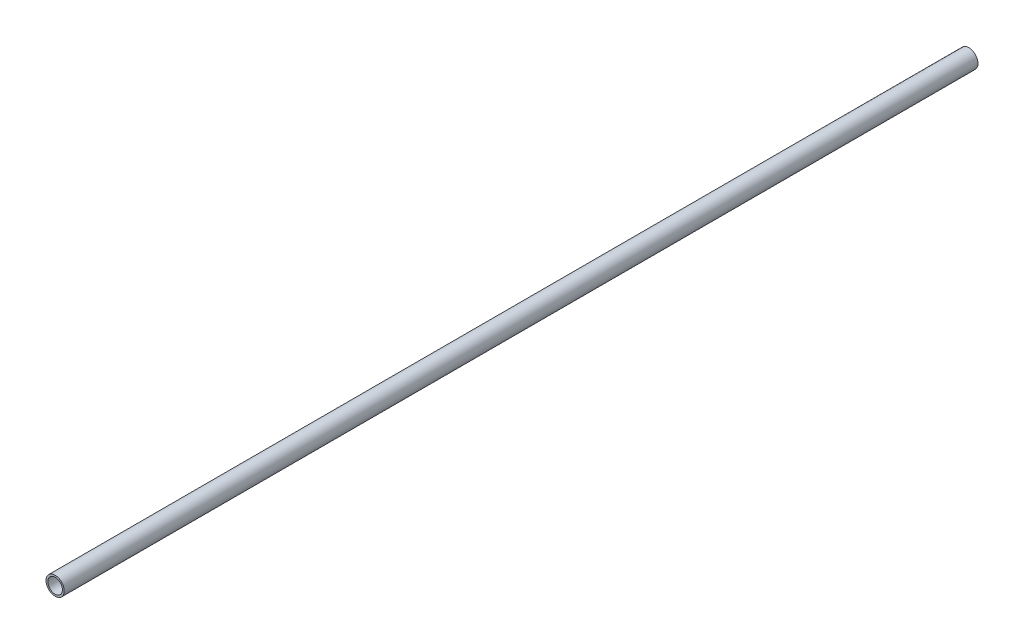
ISO-10303-21;
HEADER;
FILE_DESCRIPTION(('STEP AP214'),'2;1');
FILE_NAME('part.step','',(''),(''),'','','');
FILE_SCHEMA(('AUTOMOTIVE_DESIGN { 1 0 10303 214 1 1 1 1 }'));
ENDSEC;
DATA;
#1=APPLICATION_CONTEXT('core data for automotive mechanical design processes');
#2=APPLICATION_PROTOCOL_DEFINITION('international standard','automotive_design',2000,#1);
#3=PRODUCT_CONTEXT('',#1,'mechanical');
#4=PRODUCT('Part','Part','',(#3));
#5=PRODUCT_RELATED_PRODUCT_CATEGORY('part','',(#4));
#6=PRODUCT_DEFINITION_FORMATION('','',#4);
#7=PRODUCT_DEFINITION_CONTEXT('part definition',#1,'design');
#8=PRODUCT_DEFINITION('design','',#6,#7);
#9=PRODUCT_DEFINITION_SHAPE('','',#8);
#10=(LENGTH_UNIT() NAMED_UNIT(*) SI_UNIT(.MILLI.,.METRE.));
#11=(NAMED_UNIT(*) PLANE_ANGLE_UNIT() SI_UNIT($,.RADIAN.));
#12=(NAMED_UNIT(*) SI_UNIT($,.STERADIAN.) SOLID_ANGLE_UNIT());
#13=UNCERTAINTY_MEASURE_WITH_UNIT(LENGTH_MEASURE(1.E-05),#10,'distance_accuracy_value','');
#14=(GEOMETRIC_REPRESENTATION_CONTEXT(3) GLOBAL_UNCERTAINTY_ASSIGNED_CONTEXT((#13)) GLOBAL_UNIT_ASSIGNED_CONTEXT((#10,
#11,#12)) REPRESENTATION_CONTEXT('',''));
#15=CARTESIAN_POINT('',(0.,0.,0.));
#16=DIRECTION('',(0.,0.,1.));
#17=DIRECTION('',(1.,0.,0.));
#18=AXIS2_PLACEMENT_3D('',#15,#16,#17);
#19=CARTESIAN_POINT('',(0.,0.,500.));
#20=DIRECTION('',(0.,0.,-1.));
#21=DIRECTION('',(-1.,0.,0.));
#22=AXIS2_PLACEMENT_3D('',#19,#20,#21);
#23=CYLINDRICAL_SURFACE('',#22,5.);
#24=CARTESIAN_POINT('',(0.,0.,500.));
#25=DIRECTION('',(0.,0.,1.));
#26=DIRECTION('',(1.,0.,0.));
#27=AXIS2_PLACEMENT_3D('',#24,#25,#26);
#28=CIRCLE('',#27,5.);
#29=CARTESIAN_POINT('',(5.,0.,500.));
#30=VERTEX_POINT('',#29);
#31=EDGE_CURVE('E10',#30,#30,#28,.T.);
#32=ORIENTED_EDGE('',*,*,#31,.F.);
#33=EDGE_LOOP('',(#32));
#34=FACE_BOUND('',#33,.T.);
#35=CARTESIAN_POINT('',(0.,0.,0.));
#36=DIRECTION('',(0.,0.,1.));
#37=DIRECTION('',(1.,0.,0.));
#38=AXIS2_PLACEMENT_3D('',#35,#36,#37);
#39=CIRCLE('',#38,5.);
#40=CARTESIAN_POINT('',(5.,0.,0.));
#41=VERTEX_POINT('',#40);
#42=EDGE_CURVE('E46',#41,#41,#39,.T.);
#43=ORIENTED_EDGE('',*,*,#42,.T.);
#44=EDGE_LOOP('',(#43));
#45=FACE_BOUND('',#44,.T.);
#46=ADVANCED_FACE('F43',(#34,#45),#23,.T.);
#47=CARTESIAN_POINT('',(0.,0.,500.));
#48=DIRECTION('',(0.,0.,1.));
#49=DIRECTION('',(1.,0.,0.));
#50=AXIS2_PLACEMENT_3D('',#47,#48,#49);
#51=PLANE('',#50);
#52=CARTESIAN_POINT('',(0.,0.,500.));
#53=DIRECTION('',(0.,0.,1.));
#54=DIRECTION('',(1.,0.,0.));
#55=AXIS2_PLACEMENT_3D('',#52,#53,#54);
#56=CIRCLE('',#55,4.);
#57=CARTESIAN_POINT('',(4.,0.,500.));
#58=VERTEX_POINT('',#57);
#59=EDGE_CURVE('E57',#58,#58,#56,.T.);
#60=ORIENTED_EDGE('',*,*,#59,.F.);
#61=EDGE_LOOP('',(#60));
#62=FACE_BOUND('',#61,.T.);
#63=ORIENTED_EDGE('',*,*,#31,.T.);
#64=EDGE_LOOP('',(#63));
#65=FACE_BOUND('',#64,.T.);
#66=ADVANCED_FACE('F74',(#62,#65),#51,.T.);
#67=CARTESIAN_POINT('',(0.,0.,0.));
#68=DIRECTION('',(0.,0.,1.));
#69=DIRECTION('',(1.,0.,0.));
#70=AXIS2_PLACEMENT_3D('',#67,#68,#69);
#71=PLANE('',#70);
#72=CARTESIAN_POINT('',(0.,0.,0.));
#73=DIRECTION('',(0.,0.,1.));
#74=DIRECTION('',(1.,0.,0.));
#75=AXIS2_PLACEMENT_3D('',#72,#73,#74);
#76=CIRCLE('',#75,4.);
#77=CARTESIAN_POINT('',(4.,0.,0.));
#78=VERTEX_POINT('',#77);
#79=EDGE_CURVE('E55',#78,#78,#76,.T.);
#80=ORIENTED_EDGE('',*,*,#79,.T.);
#81=EDGE_LOOP('',(#80));
#82=FACE_BOUND('',#81,.T.);
#83=ORIENTED_EDGE('',*,*,#42,.F.);
#84=EDGE_LOOP('',(#83));
#85=FACE_BOUND('',#84,.T.);
#86=ADVANCED_FACE('F65',(#82,#85),#71,.F.);
#87=CARTESIAN_POINT('',(0.,0.,0.));
#88=DIRECTION('',(0.,0.,1.));
#89=DIRECTION('',(1.,0.,0.));
#90=AXIS2_PLACEMENT_3D('',#87,#88,#89);
#91=CYLINDRICAL_SURFACE('',#90,4.);
#92=ORIENTED_EDGE('',*,*,#79,.F.);
#93=EDGE_LOOP('',(#92));
#94=FACE_BOUND('',#93,.T.);
#95=ORIENTED_EDGE('',*,*,#59,.T.);
#96=EDGE_LOOP('',(#95));
#97=FACE_BOUND('',#96,.T.);
#98=ADVANCED_FACE('F68',(#94,#97),#91,.F.);
#99=CLOSED_SHELL('',(#46,#66,#86,#98));
#100=MANIFOLD_SOLID_BREP('B2',#99);
#101=ADVANCED_BREP_SHAPE_REPRESENTATION('',(#18,#100),#14);
#102=SHAPE_DEFINITION_REPRESENTATION(#9,#101);
ENDSEC;
END-ISO-10303-21;
